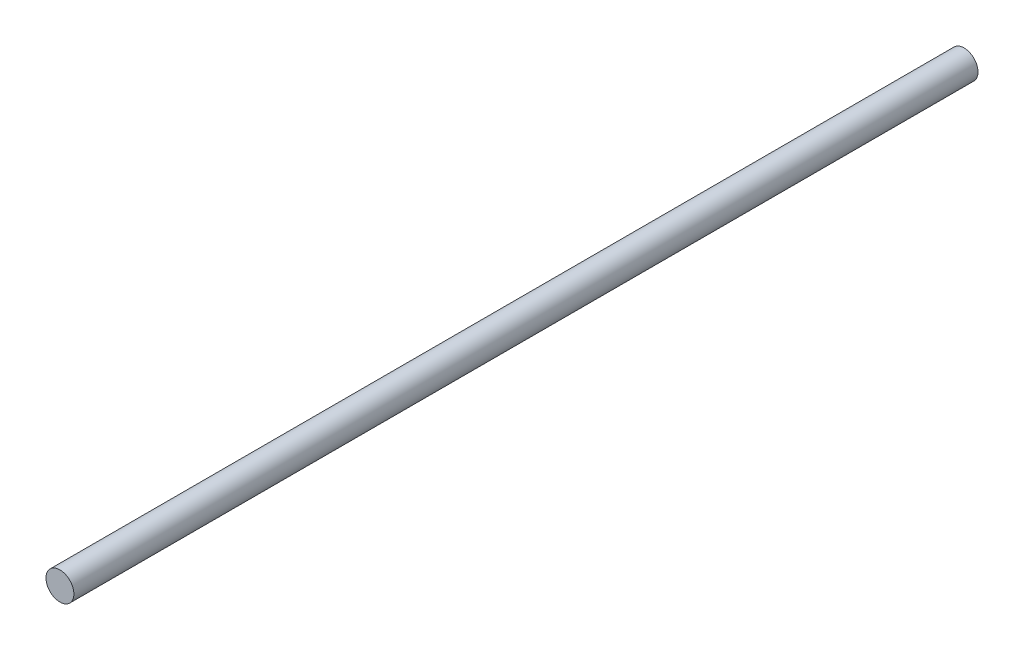
ISO-10303-21;
HEADER;
FILE_DESCRIPTION(('STEP AP214'),'2;1');
FILE_NAME('part.step','',(''),(''),'','','');
FILE_SCHEMA(('AUTOMOTIVE_DESIGN { 1 0 10303 214 1 1 1 1 }'));
ENDSEC;
DATA;
#1=APPLICATION_CONTEXT('core data for automotive mechanical design processes');
#2=APPLICATION_PROTOCOL_DEFINITION('international standard','automotive_design',2000,#1);
#3=PRODUCT_CONTEXT('',#1,'mechanical');
#4=PRODUCT('Part','Part','',(#3));
#5=PRODUCT_RELATED_PRODUCT_CATEGORY('part','',(#4));
#6=PRODUCT_DEFINITION_FORMATION('','',#4);
#7=PRODUCT_DEFINITION_CONTEXT('part definition',#1,'design');
#8=PRODUCT_DEFINITION('design','',#6,#7);
#9=PRODUCT_DEFINITION_SHAPE('','',#8);
#10=(LENGTH_UNIT() NAMED_UNIT(*) SI_UNIT(.MILLI.,.METRE.));
#11=(NAMED_UNIT(*) PLANE_ANGLE_UNIT() SI_UNIT($,.RADIAN.));
#12=(NAMED_UNIT(*) SI_UNIT($,.STERADIAN.) SOLID_ANGLE_UNIT());
#13=UNCERTAINTY_MEASURE_WITH_UNIT(LENGTH_MEASURE(1.E-05),#10,'distance_accuracy_value','');
#14=(GEOMETRIC_REPRESENTATION_CONTEXT(3) GLOBAL_UNCERTAINTY_ASSIGNED_CONTEXT((#13)) GLOBAL_UNIT_ASSIGNED_CONTEXT((#10,
#11,#12)) REPRESENTATION_CONTEXT('',''));
#15=CARTESIAN_POINT('',(0.,0.,0.));
#16=DIRECTION('',(0.,0.,1.));
#17=DIRECTION('',(1.,0.,0.));
#18=AXIS2_PLACEMENT_3D('',#15,#16,#17);
#19=CARTESIAN_POINT('',(0.,0.,325.));
#20=DIRECTION('',(0.,0.,-1.));
#21=DIRECTION('',(-1.,0.,0.));
#22=AXIS2_PLACEMENT_3D('',#19,#20,#21);
#23=CYLINDRICAL_SURFACE('',#22,5.);
#24=CARTESIAN_POINT('',(0.,0.,325.));
#25=DIRECTION('',(0.,0.,1.));
#26=DIRECTION('',(1.,0.,0.));
#27=AXIS2_PLACEMENT_3D('',#24,#25,#26);
#28=CIRCLE('',#27,5.);
#29=CARTESIAN_POINT('',(5.,0.,325.));
#30=VERTEX_POINT('',#29);
#31=EDGE_CURVE('E10',#30,#30,#28,.T.);
#32=ORIENTED_EDGE('',*,*,#31,.F.);
#33=EDGE_LOOP('',(#32));
#34=FACE_BOUND('',#33,.T.);
#35=CARTESIAN_POINT('',(0.,0.,1.));
#36=DIRECTION('',(0.,0.,1.));
#37=DIRECTION('',(1.,0.,0.));
#38=AXIS2_PLACEMENT_3D('',#35,#36,#37);
#39=CIRCLE('',#38,5.);
#40=CARTESIAN_POINT('',(5.,0.,1.));
#41=VERTEX_POINT('',#40);
#42=EDGE_CURVE('E37',#41,#41,#39,.T.);
#43=ORIENTED_EDGE('',*,*,#42,.T.);
#44=EDGE_LOOP('',(#43));
#45=FACE_BOUND('',#44,.T.);
#46=ADVANCED_FACE('F34',(#34,#45),#23,.T.);
#47=CARTESIAN_POINT('',(0.,0.,325.));
#48=DIRECTION('',(0.,0.,1.));
#49=DIRECTION('',(1.,0.,0.));
#50=AXIS2_PLACEMENT_3D('',#47,#48,#49);
#51=PLANE('',#50);
#52=ORIENTED_EDGE('',*,*,#31,.T.);
#53=EDGE_LOOP('',(#52));
#54=FACE_BOUND('',#53,.T.);
#55=ADVANCED_FACE('F49',(#54),#51,.T.);
#56=CARTESIAN_POINT('',(0.,0.,1.));
#57=DIRECTION('',(0.,0.,1.));
#58=DIRECTION('',(1.,0.,0.));
#59=AXIS2_PLACEMENT_3D('',#56,#57,#58);
#60=PLANE('',#59);
#61=ORIENTED_EDGE('',*,*,#42,.F.);
#62=EDGE_LOOP('',(#61));
#63=FACE_BOUND('',#62,.T.);
#64=ADVANCED_FACE('F47',(#63),#60,.F.);
#65=CLOSED_SHELL('',(#46,#55,#64));
#66=MANIFOLD_SOLID_BREP('B2',#65);
#67=ADVANCED_BREP_SHAPE_REPRESENTATION('',(#18,#66),#14);
#68=SHAPE_DEFINITION_REPRESENTATION(#9,#67);
ENDSEC;
END-ISO-10303-21;
